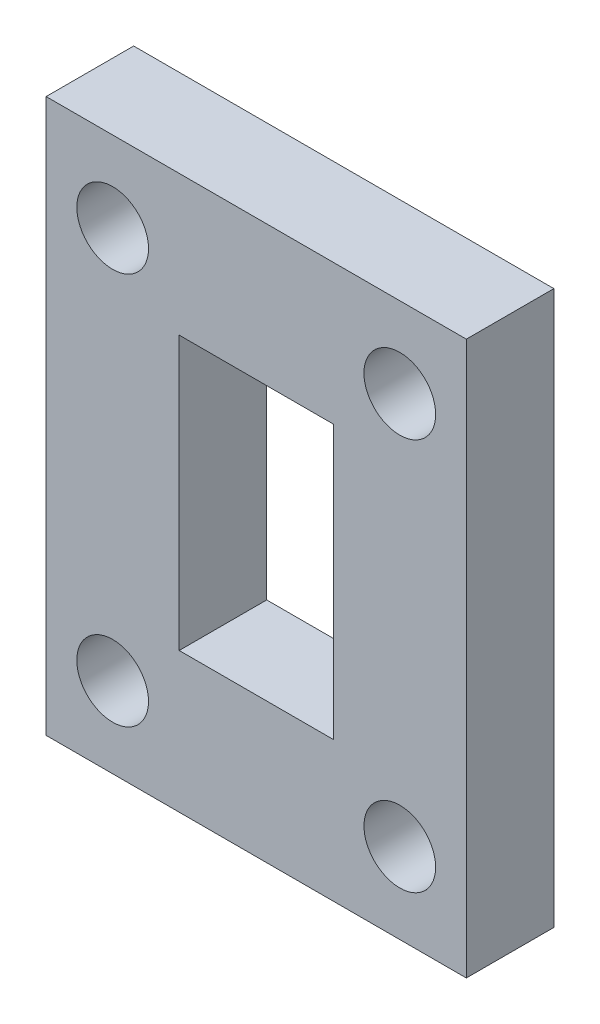
ISO-10303-21;
HEADER;
FILE_DESCRIPTION(('STEP AP214'),'2;1');
FILE_NAME('part.step','',(''),(''),'','','');
FILE_SCHEMA(('AUTOMOTIVE_DESIGN { 1 0 10303 214 1 1 1 1 }'));
ENDSEC;
DATA;
#1=APPLICATION_CONTEXT('core data for automotive mechanical design processes');
#2=APPLICATION_PROTOCOL_DEFINITION('international standard','automotive_design',2000,#1);
#3=PRODUCT_CONTEXT('',#1,'mechanical');
#4=PRODUCT('Part','Part','',(#3));
#5=PRODUCT_RELATED_PRODUCT_CATEGORY('part','',(#4));
#6=PRODUCT_DEFINITION_FORMATION('','',#4);
#7=PRODUCT_DEFINITION_CONTEXT('part definition',#1,'design');
#8=PRODUCT_DEFINITION('design','',#6,#7);
#9=PRODUCT_DEFINITION_SHAPE('','',#8);
#10=(LENGTH_UNIT() NAMED_UNIT(*) SI_UNIT(.MILLI.,.METRE.));
#11=(NAMED_UNIT(*) PLANE_ANGLE_UNIT() SI_UNIT($,.RADIAN.));
#12=(NAMED_UNIT(*) SI_UNIT($,.STERADIAN.) SOLID_ANGLE_UNIT());
#13=UNCERTAINTY_MEASURE_WITH_UNIT(LENGTH_MEASURE(1.E-05),#10,'distance_accuracy_value','');
#14=(GEOMETRIC_REPRESENTATION_CONTEXT(3) GLOBAL_UNCERTAINTY_ASSIGNED_CONTEXT((#13)) GLOBAL_UNIT_ASSIGNED_CONTEXT((#10,
#11,#12)) REPRESENTATION_CONTEXT('',''));
#15=CARTESIAN_POINT('',(0.,0.,0.));
#16=DIRECTION('',(0.,0.,1.));
#17=DIRECTION('',(1.,0.,0.));
#18=AXIS2_PLACEMENT_3D('',#15,#16,#17);
#19=CARTESIAN_POINT('',(0.,0.,3.175));
#20=DIRECTION('',(0.,0.,1.));
#21=DIRECTION('',(1.,0.,0.));
#22=AXIS2_PLACEMENT_3D('',#19,#20,#21);
#23=PLANE('',#22);
#24=CARTESIAN_POINT('',(-5.207,-7.112,3.175));
#25=DIRECTION('',(0.,0.,1.));
#26=DIRECTION('',(-1.,0.,0.));
#27=AXIS2_PLACEMENT_3D('',#24,#25,#26);
#28=CIRCLE('',#27,1.3);
#29=CARTESIAN_POINT('',(-6.507,-7.112,3.175));
#30=VERTEX_POINT('',#29);
#31=EDGE_CURVE('E254',#30,#30,#28,.T.);
#32=ORIENTED_EDGE('',*,*,#31,.F.);
#33=EDGE_LOOP('',(#32));
#34=FACE_BOUND('',#33,.T.);
#35=CARTESIAN_POINT('',(5.207,-7.112,3.175));
#36=DIRECTION('',(0.,0.,1.));
#37=DIRECTION('',(1.,0.,0.));
#38=AXIS2_PLACEMENT_3D('',#35,#36,#37);
#39=CIRCLE('',#38,1.3);
#40=CARTESIAN_POINT('',(6.507,-7.112,3.175));
#41=VERTEX_POINT('',#40);
#42=EDGE_CURVE('E248',#41,#41,#39,.T.);
#43=ORIENTED_EDGE('',*,*,#42,.F.);
#44=EDGE_LOOP('',(#43));
#45=FACE_BOUND('',#44,.T.);
#46=CARTESIAN_POINT('',(5.207,7.112,3.175));
#47=DIRECTION('',(0.,0.,1.));
#48=DIRECTION('',(-1.,0.,0.));
#49=AXIS2_PLACEMENT_3D('',#46,#47,#48);
#50=CIRCLE('',#49,1.3);
#51=CARTESIAN_POINT('',(3.907,7.112,3.175));
#52=VERTEX_POINT('',#51);
#53=EDGE_CURVE('E236',#52,#52,#50,.T.);
#54=ORIENTED_EDGE('',*,*,#53,.F.);
#55=EDGE_LOOP('',(#54));
#56=FACE_BOUND('',#55,.T.);
#57=CARTESIAN_POINT('',(-5.207,7.112,3.175));
#58=DIRECTION('',(0.,0.,1.));
#59=DIRECTION('',(1.,0.,0.));
#60=AXIS2_PLACEMENT_3D('',#57,#58,#59);
#61=CIRCLE('',#60,1.3);
#62=CARTESIAN_POINT('',(-3.907,7.112,3.175));
#63=VERTEX_POINT('',#62);
#64=EDGE_CURVE('E241',#63,#63,#61,.T.);
#65=ORIENTED_EDGE('',*,*,#64,.F.);
#66=EDGE_LOOP('',(#65));
#67=FACE_BOUND('',#66,.T.);
#68=DIRECTION('',(0.,-1.,0.));
#69=VECTOR('',#68,1.);
#70=CARTESIAN_POINT('',(-7.62,-10.033,3.175));
#71=LINE('',#70,#69);
#72=CARTESIAN_POINT('',(-7.62,10.033,3.175));
#73=VERTEX_POINT('',#72);
#74=CARTESIAN_POINT('',(-7.62,-10.033,3.175));
#75=VERTEX_POINT('',#74);
#76=EDGE_CURVE('E136',#73,#75,#71,.T.);
#77=ORIENTED_EDGE('',*,*,#76,.T.);
#78=DIRECTION('',(1.,0.,0.));
#79=VECTOR('',#78,1.);
#80=CARTESIAN_POINT('',(7.62,-10.033,3.175));
#81=LINE('',#80,#79);
#82=CARTESIAN_POINT('',(7.62,-10.033,3.175));
#83=VERTEX_POINT('',#82);
#84=EDGE_CURVE('E139',#75,#83,#81,.T.);
#85=ORIENTED_EDGE('',*,*,#84,.T.);
#86=DIRECTION('',(0.,1.,0.));
#87=VECTOR('',#86,1.);
#88=CARTESIAN_POINT('',(7.62,-10.033,3.175));
#89=LINE('',#88,#87);
#90=CARTESIAN_POINT('',(7.62,10.033,3.175));
#91=VERTEX_POINT('',#90);
#92=EDGE_CURVE('E142',#83,#91,#89,.T.);
#93=ORIENTED_EDGE('',*,*,#92,.T.);
#94=DIRECTION('',(-1.,0.,0.));
#95=VECTOR('',#94,1.);
#96=CARTESIAN_POINT('',(7.62,10.033,3.175));
#97=LINE('',#96,#95);
#98=EDGE_CURVE('E144',#91,#73,#97,.T.);
#99=ORIENTED_EDGE('',*,*,#98,.T.);
#100=EDGE_LOOP('',(#77,#85,#93,#99));
#101=FACE_BOUND('',#100,.T.);
#102=DIRECTION('',(1.,0.,0.));
#103=VECTOR('',#102,1.);
#104=CARTESIAN_POINT('',(-2.794,-4.953,3.175));
#105=LINE('',#104,#103);
#106=CARTESIAN_POINT('',(-2.794,-4.953,3.175));
#107=VERTEX_POINT('',#106);
#108=CARTESIAN_POINT('',(2.794,-4.953,3.175));
#109=VERTEX_POINT('',#108);
#110=EDGE_CURVE('E106',#107,#109,#105,.T.);
#111=ORIENTED_EDGE('',*,*,#110,.F.);
#112=DIRECTION('',(0.,-1.,0.));
#113=VECTOR('',#112,1.);
#114=CARTESIAN_POINT('',(-2.794,4.953,3.175));
#115=LINE('',#114,#113);
#116=CARTESIAN_POINT('',(-2.794,4.953,3.175));
#117=VERTEX_POINT('',#116);
#118=EDGE_CURVE('E98',#117,#107,#115,.T.);
#119=ORIENTED_EDGE('',*,*,#118,.F.);
#120=DIRECTION('',(-1.,0.,0.));
#121=VECTOR('',#120,1.);
#122=CARTESIAN_POINT('',(-2.794,4.953,3.175));
#123=LINE('',#122,#121);
#124=CARTESIAN_POINT('',(2.794,4.953,3.175));
#125=VERTEX_POINT('',#124);
#126=EDGE_CURVE('E120',#125,#117,#123,.T.);
#127=ORIENTED_EDGE('',*,*,#126,.F.);
#128=DIRECTION('',(0.,1.,0.));
#129=VECTOR('',#128,1.);
#130=CARTESIAN_POINT('',(2.794,4.953,3.175));
#131=LINE('',#130,#129);
#132=EDGE_CURVE('E118',#109,#125,#131,.T.);
#133=ORIENTED_EDGE('',*,*,#132,.F.);
#134=EDGE_LOOP('',(#111,#119,#127,#133));
#135=FACE_BOUND('',#134,.T.);
#136=ADVANCED_FACE('F33',(#34,#45,#56,#67,#101,#135),#23,.T.);
#137=CARTESIAN_POINT('',(0.,0.,0.));
#138=DIRECTION('',(0.,0.,1.));
#139=DIRECTION('',(1.,0.,0.));
#140=AXIS2_PLACEMENT_3D('',#137,#138,#139);
#141=PLANE('',#140);
#142=CARTESIAN_POINT('',(-5.207,-7.112,0.));
#143=DIRECTION('',(0.,0.,1.));
#144=DIRECTION('',(1.,0.,0.));
#145=AXIS2_PLACEMENT_3D('',#142,#143,#144);
#146=CIRCLE('',#145,1.3);
#147=CARTESIAN_POINT('',(-3.907,-7.112,0.));
#148=VERTEX_POINT('',#147);
#149=EDGE_CURVE('E251',#148,#148,#146,.F.);
#150=ORIENTED_EDGE('',*,*,#149,.F.);
#151=EDGE_LOOP('',(#150));
#152=FACE_BOUND('',#151,.T.);
#153=CARTESIAN_POINT('',(5.207,-7.112,0.));
#154=DIRECTION('',(0.,0.,1.));
#155=DIRECTION('',(1.,0.,0.));
#156=AXIS2_PLACEMENT_3D('',#153,#154,#155);
#157=CIRCLE('',#156,1.3);
#158=CARTESIAN_POINT('',(6.507,-7.112,0.));
#159=VERTEX_POINT('',#158);
#160=EDGE_CURVE('E245',#159,#159,#157,.F.);
#161=ORIENTED_EDGE('',*,*,#160,.F.);
#162=EDGE_LOOP('',(#161));
#163=FACE_BOUND('',#162,.T.);
#164=CARTESIAN_POINT('',(5.207,7.112,0.));
#165=DIRECTION('',(0.,0.,1.));
#166=DIRECTION('',(1.,0.,0.));
#167=AXIS2_PLACEMENT_3D('',#164,#165,#166);
#168=CIRCLE('',#167,1.3);
#169=CARTESIAN_POINT('',(6.507,7.112,0.));
#170=VERTEX_POINT('',#169);
#171=EDGE_CURVE('E239',#170,#170,#168,.F.);
#172=ORIENTED_EDGE('',*,*,#171,.F.);
#173=EDGE_LOOP('',(#172));
#174=FACE_BOUND('',#173,.T.);
#175=CARTESIAN_POINT('',(-5.207,7.112,0.));
#176=DIRECTION('',(0.,0.,1.));
#177=DIRECTION('',(1.,0.,0.));
#178=AXIS2_PLACEMENT_3D('',#175,#176,#177);
#179=CIRCLE('',#178,1.3);
#180=CARTESIAN_POINT('',(-3.907,7.112,0.));
#181=VERTEX_POINT('',#180);
#182=EDGE_CURVE('E126',#181,#181,#179,.F.);
#183=ORIENTED_EDGE('',*,*,#182,.F.);
#184=EDGE_LOOP('',(#183));
#185=FACE_BOUND('',#184,.T.);
#186=DIRECTION('',(0.,-1.,0.));
#187=VECTOR('',#186,1.);
#188=CARTESIAN_POINT('',(-7.62,-10.033,0.));
#189=LINE('',#188,#187);
#190=CARTESIAN_POINT('',(-7.62,10.033,0.));
#191=VERTEX_POINT('',#190);
#192=CARTESIAN_POINT('',(-7.62,-10.033,0.));
#193=VERTEX_POINT('',#192);
#194=EDGE_CURVE('E114',#191,#193,#189,.T.);
#195=ORIENTED_EDGE('',*,*,#194,.F.);
#196=DIRECTION('',(-1.,0.,0.));
#197=VECTOR('',#196,1.);
#198=CARTESIAN_POINT('',(7.62,10.033,0.));
#199=LINE('',#198,#197);
#200=CARTESIAN_POINT('',(7.62,10.033,0.));
#201=VERTEX_POINT('',#200);
#202=EDGE_CURVE('E140',#201,#191,#199,.T.);
#203=ORIENTED_EDGE('',*,*,#202,.F.);
#204=DIRECTION('',(0.,1.,0.));
#205=VECTOR('',#204,1.);
#206=CARTESIAN_POINT('',(7.62,-10.033,0.));
#207=LINE('',#206,#205);
#208=CARTESIAN_POINT('',(7.62,-10.033,0.));
#209=VERTEX_POINT('',#208);
#210=EDGE_CURVE('E151',#209,#201,#207,.T.);
#211=ORIENTED_EDGE('',*,*,#210,.F.);
#212=DIRECTION('',(1.,0.,0.));
#213=VECTOR('',#212,1.);
#214=CARTESIAN_POINT('',(7.62,-10.033,0.));
#215=LINE('',#214,#213);
#216=EDGE_CURVE('E149',#193,#209,#215,.T.);
#217=ORIENTED_EDGE('',*,*,#216,.F.);
#218=EDGE_LOOP('',(#195,#203,#211,#217));
#219=FACE_BOUND('',#218,.T.);
#220=DIRECTION('',(0.,-1.,0.));
#221=VECTOR('',#220,1.);
#222=CARTESIAN_POINT('',(-2.794,4.953,0.));
#223=LINE('',#222,#221);
#224=CARTESIAN_POINT('',(-2.794,4.953,0.));
#225=VERTEX_POINT('',#224);
#226=CARTESIAN_POINT('',(-2.794,-4.953,0.));
#227=VERTEX_POINT('',#226);
#228=EDGE_CURVE('E56',#225,#227,#223,.T.);
#229=ORIENTED_EDGE('',*,*,#228,.T.);
#230=DIRECTION('',(1.,0.,0.));
#231=VECTOR('',#230,1.);
#232=CARTESIAN_POINT('',(-2.794,-4.953,0.));
#233=LINE('',#232,#231);
#234=CARTESIAN_POINT('',(2.794,-4.953,0.));
#235=VERTEX_POINT('',#234);
#236=EDGE_CURVE('E113',#227,#235,#233,.T.);
#237=ORIENTED_EDGE('',*,*,#236,.T.);
#238=DIRECTION('',(0.,1.,0.));
#239=VECTOR('',#238,1.);
#240=CARTESIAN_POINT('',(2.794,4.953,0.));
#241=LINE('',#240,#239);
#242=CARTESIAN_POINT('',(2.794,4.953,0.));
#243=VERTEX_POINT('',#242);
#244=EDGE_CURVE('E128',#235,#243,#241,.T.);
#245=ORIENTED_EDGE('',*,*,#244,.T.);
#246=DIRECTION('',(-1.,0.,0.));
#247=VECTOR('',#246,1.);
#248=CARTESIAN_POINT('',(-2.794,4.953,0.));
#249=LINE('',#248,#247);
#250=EDGE_CURVE('E107',#243,#225,#249,.T.);
#251=ORIENTED_EDGE('',*,*,#250,.T.);
#252=EDGE_LOOP('',(#229,#237,#245,#251));
#253=FACE_BOUND('',#252,.T.);
#254=ADVANCED_FACE('F169',(#152,#163,#174,#185,#219,#253),#141,.F.);
#255=CARTESIAN_POINT('',(-7.62,-10.033,3.175));
#256=DIRECTION('',(1.,0.,0.));
#257=DIRECTION('',(0.,0.,-1.));
#258=AXIS2_PLACEMENT_3D('',#255,#256,#257);
#259=PLANE('',#258);
#260=ORIENTED_EDGE('',*,*,#194,.T.);
#261=DIRECTION('',(0.,0.,-1.));
#262=VECTOR('',#261,1.);
#263=CARTESIAN_POINT('',(-7.62,-10.033,3.175));
#264=LINE('',#263,#262);
#265=EDGE_CURVE('E11',#75,#193,#264,.T.);
#266=ORIENTED_EDGE('',*,*,#265,.F.);
#267=ORIENTED_EDGE('',*,*,#76,.F.);
#268=DIRECTION('',(0.,0.,-1.));
#269=VECTOR('',#268,1.);
#270=CARTESIAN_POINT('',(-7.62,10.033,3.175));
#271=LINE('',#270,#269);
#272=EDGE_CURVE('E146',#73,#191,#271,.T.);
#273=ORIENTED_EDGE('',*,*,#272,.T.);
#274=EDGE_LOOP('',(#260,#266,#267,#273));
#275=FACE_BOUND('',#274,.T.);
#276=ADVANCED_FACE('F35',(#275),#259,.F.);
#277=CARTESIAN_POINT('',(7.62,-10.033,3.175));
#278=DIRECTION('',(0.,1.,0.));
#279=DIRECTION('',(0.,0.,1.));
#280=AXIS2_PLACEMENT_3D('',#277,#278,#279);
#281=PLANE('',#280);
#282=ORIENTED_EDGE('',*,*,#216,.T.);
#283=DIRECTION('',(0.,0.,-1.));
#284=VECTOR('',#283,1.);
#285=CARTESIAN_POINT('',(7.62,-10.033,3.175));
#286=LINE('',#285,#284);
#287=EDGE_CURVE('E41',#83,#209,#286,.T.);
#288=ORIENTED_EDGE('',*,*,#287,.F.);
#289=ORIENTED_EDGE('',*,*,#84,.F.);
#290=ORIENTED_EDGE('',*,*,#265,.T.);
#291=EDGE_LOOP('',(#282,#288,#289,#290));
#292=FACE_BOUND('',#291,.T.);
#293=ADVANCED_FACE('F179',(#292),#281,.F.);
#294=CARTESIAN_POINT('',(7.62,-10.033,3.175));
#295=DIRECTION('',(-1.,0.,0.));
#296=DIRECTION('',(0.,0.,1.));
#297=AXIS2_PLACEMENT_3D('',#294,#295,#296);
#298=PLANE('',#297);
#299=ORIENTED_EDGE('',*,*,#210,.T.);
#300=DIRECTION('',(0.,0.,-1.));
#301=VECTOR('',#300,1.);
#302=CARTESIAN_POINT('',(7.62,10.033,3.175));
#303=LINE('',#302,#301);
#304=EDGE_CURVE('E156',#91,#201,#303,.T.);
#305=ORIENTED_EDGE('',*,*,#304,.F.);
#306=ORIENTED_EDGE('',*,*,#92,.F.);
#307=ORIENTED_EDGE('',*,*,#287,.T.);
#308=EDGE_LOOP('',(#299,#305,#306,#307));
#309=FACE_BOUND('',#308,.T.);
#310=ADVANCED_FACE('F163',(#309),#298,.F.);
#311=CARTESIAN_POINT('',(7.62,10.033,3.175));
#312=DIRECTION('',(0.,-1.,0.));
#313=DIRECTION('',(0.,0.,-1.));
#314=AXIS2_PLACEMENT_3D('',#311,#312,#313);
#315=PLANE('',#314);
#316=ORIENTED_EDGE('',*,*,#202,.T.);
#317=ORIENTED_EDGE('',*,*,#272,.F.);
#318=ORIENTED_EDGE('',*,*,#98,.F.);
#319=ORIENTED_EDGE('',*,*,#304,.T.);
#320=EDGE_LOOP('',(#316,#317,#318,#319));
#321=FACE_BOUND('',#320,.T.);
#322=ADVANCED_FACE('F173',(#321),#315,.F.);
#323=CARTESIAN_POINT('',(-2.794,4.953,3.175));
#324=DIRECTION('',(1.,0.,0.));
#325=DIRECTION('',(0.,0.,-1.));
#326=AXIS2_PLACEMENT_3D('',#323,#324,#325);
#327=PLANE('',#326);
#328=ORIENTED_EDGE('',*,*,#228,.F.);
#329=DIRECTION('',(0.,0.,-1.));
#330=VECTOR('',#329,1.);
#331=CARTESIAN_POINT('',(-2.794,4.953,3.175));
#332=LINE('',#331,#330);
#333=EDGE_CURVE('E102',#117,#225,#332,.T.);
#334=ORIENTED_EDGE('',*,*,#333,.F.);
#335=ORIENTED_EDGE('',*,*,#118,.T.);
#336=DIRECTION('',(0.,0.,-1.));
#337=VECTOR('',#336,1.);
#338=CARTESIAN_POINT('',(-2.794,-4.953,3.175));
#339=LINE('',#338,#337);
#340=EDGE_CURVE('E101',#107,#227,#339,.T.);
#341=ORIENTED_EDGE('',*,*,#340,.T.);
#342=EDGE_LOOP('',(#328,#334,#335,#341));
#343=FACE_BOUND('',#342,.T.);
#344=ADVANCED_FACE('F100',(#343),#327,.T.);
#345=CARTESIAN_POINT('',(-2.794,-4.953,3.175));
#346=DIRECTION('',(0.,1.,0.));
#347=DIRECTION('',(0.,0.,1.));
#348=AXIS2_PLACEMENT_3D('',#345,#346,#347);
#349=PLANE('',#348);
#350=ORIENTED_EDGE('',*,*,#236,.F.);
#351=ORIENTED_EDGE('',*,*,#340,.F.);
#352=ORIENTED_EDGE('',*,*,#110,.T.);
#353=DIRECTION('',(0.,0.,-1.));
#354=VECTOR('',#353,1.);
#355=CARTESIAN_POINT('',(2.794,-4.953,3.175));
#356=LINE('',#355,#354);
#357=EDGE_CURVE('E115',#109,#235,#356,.T.);
#358=ORIENTED_EDGE('',*,*,#357,.T.);
#359=EDGE_LOOP('',(#350,#351,#352,#358));
#360=FACE_BOUND('',#359,.T.);
#361=ADVANCED_FACE('F110',(#360),#349,.T.);
#362=CARTESIAN_POINT('',(2.794,4.953,3.175));
#363=DIRECTION('',(-1.,0.,0.));
#364=DIRECTION('',(0.,0.,1.));
#365=AXIS2_PLACEMENT_3D('',#362,#363,#364);
#366=PLANE('',#365);
#367=ORIENTED_EDGE('',*,*,#244,.F.);
#368=ORIENTED_EDGE('',*,*,#357,.F.);
#369=ORIENTED_EDGE('',*,*,#132,.T.);
#370=DIRECTION('',(0.,0.,-1.));
#371=VECTOR('',#370,1.);
#372=CARTESIAN_POINT('',(2.794,4.953,3.175));
#373=LINE('',#372,#371);
#374=EDGE_CURVE('E48',#125,#243,#373,.T.);
#375=ORIENTED_EDGE('',*,*,#374,.T.);
#376=EDGE_LOOP('',(#367,#368,#369,#375));
#377=FACE_BOUND('',#376,.T.);
#378=ADVANCED_FACE('F206',(#377),#366,.T.);
#379=CARTESIAN_POINT('',(-2.794,4.953,3.175));
#380=DIRECTION('',(0.,-1.,0.));
#381=DIRECTION('',(0.,0.,-1.));
#382=AXIS2_PLACEMENT_3D('',#379,#380,#381);
#383=PLANE('',#382);
#384=ORIENTED_EDGE('',*,*,#250,.F.);
#385=ORIENTED_EDGE('',*,*,#374,.F.);
#386=ORIENTED_EDGE('',*,*,#126,.T.);
#387=ORIENTED_EDGE('',*,*,#333,.T.);
#388=EDGE_LOOP('',(#384,#385,#386,#387));
#389=FACE_BOUND('',#388,.T.);
#390=ADVANCED_FACE('F210',(#389),#383,.T.);
#391=CARTESIAN_POINT('',(-5.207,7.112,-0.00100000000000013));
#392=DIRECTION('',(0.,0.,1.));
#393=DIRECTION('',(1.,0.,0.));
#394=AXIS2_PLACEMENT_3D('',#391,#392,#393);
#395=CYLINDRICAL_SURFACE('',#394,1.3);
#396=ORIENTED_EDGE('',*,*,#64,.T.);
#397=EDGE_LOOP('',(#396));
#398=FACE_BOUND('',#397,.T.);
#399=ORIENTED_EDGE('',*,*,#182,.T.);
#400=EDGE_LOOP('',(#399));
#401=FACE_BOUND('',#400,.T.);
#402=ADVANCED_FACE('F216',(#398,#401),#395,.F.);
#403=CARTESIAN_POINT('',(5.207,7.112,-0.00100000000000013));
#404=DIRECTION('',(0.,0.,1.));
#405=DIRECTION('',(1.,0.,0.));
#406=AXIS2_PLACEMENT_3D('',#403,#404,#405);
#407=CYLINDRICAL_SURFACE('',#406,1.3);
#408=ORIENTED_EDGE('',*,*,#53,.T.);
#409=EDGE_LOOP('',(#408));
#410=FACE_BOUND('',#409,.T.);
#411=ORIENTED_EDGE('',*,*,#171,.T.);
#412=EDGE_LOOP('',(#411));
#413=FACE_BOUND('',#412,.T.);
#414=ADVANCED_FACE('F219',(#410,#413),#407,.F.);
#415=CARTESIAN_POINT('',(5.207,-7.112,-0.00100000000000013));
#416=DIRECTION('',(0.,0.,1.));
#417=DIRECTION('',(1.,0.,0.));
#418=AXIS2_PLACEMENT_3D('',#415,#416,#417);
#419=CYLINDRICAL_SURFACE('',#418,1.3);
#420=ORIENTED_EDGE('',*,*,#42,.T.);
#421=EDGE_LOOP('',(#420));
#422=FACE_BOUND('',#421,.T.);
#423=ORIENTED_EDGE('',*,*,#160,.T.);
#424=EDGE_LOOP('',(#423));
#425=FACE_BOUND('',#424,.T.);
#426=ADVANCED_FACE('F224',(#422,#425),#419,.F.);
#427=CARTESIAN_POINT('',(-5.207,-7.112,-0.00100000000000013));
#428=DIRECTION('',(0.,0.,1.));
#429=DIRECTION('',(1.,0.,0.));
#430=AXIS2_PLACEMENT_3D('',#427,#428,#429);
#431=CYLINDRICAL_SURFACE('',#430,1.3);
#432=ORIENTED_EDGE('',*,*,#31,.T.);
#433=EDGE_LOOP('',(#432));
#434=FACE_BOUND('',#433,.T.);
#435=ORIENTED_EDGE('',*,*,#149,.T.);
#436=EDGE_LOOP('',(#435));
#437=FACE_BOUND('',#436,.T.);
#438=ADVANCED_FACE('F221',(#434,#437),#431,.F.);
#439=CLOSED_SHELL('',(#136,#254,#276,#293,#310,#322,#344,#361,#378,#390,#402,#414,#426,#438));
#440=MANIFOLD_SOLID_BREP('B2',#439);
#441=ADVANCED_BREP_SHAPE_REPRESENTATION('',(#18,#440),#14);
#442=SHAPE_DEFINITION_REPRESENTATION(#9,#441);
ENDSEC;
END-ISO-10303-21;
